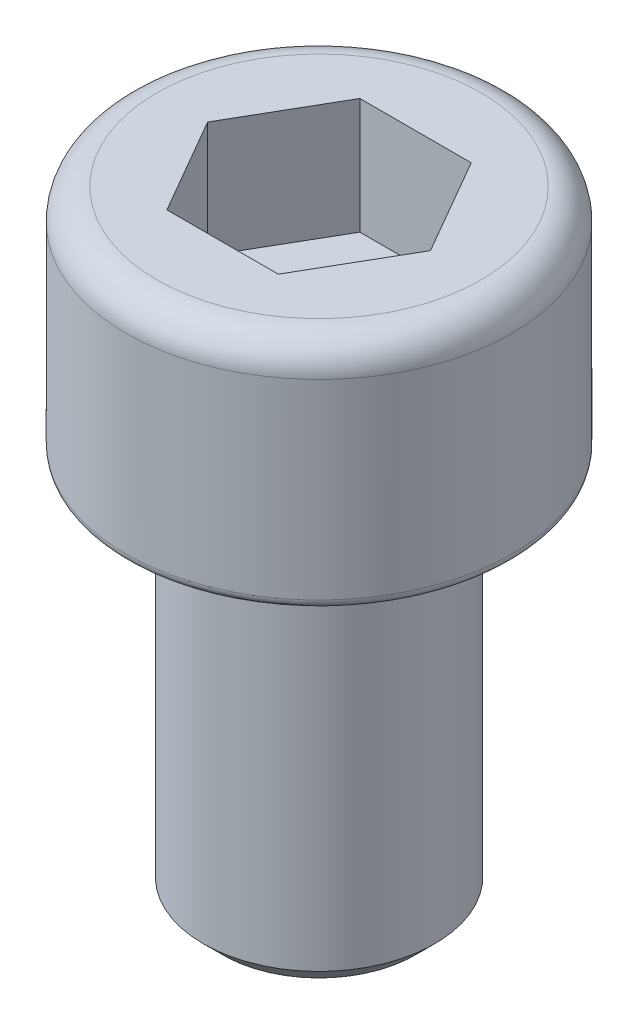
ISO-10303-21;
HEADER;
FILE_DESCRIPTION(('STEP AP214'),'2;1');
FILE_NAME('part.step','',(''),(''),'','','');
FILE_SCHEMA(('AUTOMOTIVE_DESIGN { 1 0 10303 214 1 1 1 1 }'));
ENDSEC;
DATA;
#1=APPLICATION_CONTEXT('core data for automotive mechanical design processes');
#2=APPLICATION_PROTOCOL_DEFINITION('international standard','automotive_design',2000,#1);
#3=PRODUCT_CONTEXT('',#1,'mechanical');
#4=PRODUCT('Part','Part','',(#3));
#5=PRODUCT_RELATED_PRODUCT_CATEGORY('part','',(#4));
#6=PRODUCT_DEFINITION_FORMATION('','',#4);
#7=PRODUCT_DEFINITION_CONTEXT('part definition',#1,'design');
#8=PRODUCT_DEFINITION('design','',#6,#7);
#9=PRODUCT_DEFINITION_SHAPE('','',#8);
#10=(LENGTH_UNIT() NAMED_UNIT(*) SI_UNIT(.MILLI.,.METRE.));
#11=(NAMED_UNIT(*) PLANE_ANGLE_UNIT() SI_UNIT($,.RADIAN.));
#12=(NAMED_UNIT(*) SI_UNIT($,.STERADIAN.) SOLID_ANGLE_UNIT());
#13=UNCERTAINTY_MEASURE_WITH_UNIT(LENGTH_MEASURE(1.E-05),#10,'distance_accuracy_value','');
#14=(GEOMETRIC_REPRESENTATION_CONTEXT(3) GLOBAL_UNCERTAINTY_ASSIGNED_CONTEXT((#13)) GLOBAL_UNIT_ASSIGNED_CONTEXT((#10,
#11,#12)) REPRESENTATION_CONTEXT('',''));
#15=CARTESIAN_POINT('',(0.,0.,0.));
#16=DIRECTION('',(0.,0.,1.));
#17=DIRECTION('',(1.,0.,0.));
#18=AXIS2_PLACEMENT_3D('',#15,#16,#17);
#19=CARTESIAN_POINT('',(0.,0.,0.));
#20=DIRECTION('',(0.,1.,0.));
#21=DIRECTION('',(0.,0.,1.));
#22=AXIS2_PLACEMENT_3D('',#19,#20,#21);
#23=PLANE('',#22);
#24=CARTESIAN_POINT('',(0.,0.,0.));
#25=DIRECTION('',(0.,1.,0.));
#26=DIRECTION('',(0.,0.,1.));
#27=AXIS2_PLACEMENT_3D('',#24,#25,#26);
#28=CIRCLE('',#27,4.2);
#29=CARTESIAN_POINT('',(0.,0.,4.2));
#30=VERTEX_POINT('',#29);
#31=EDGE_CURVE('E186',#30,#30,#28,.T.);
#32=ORIENTED_EDGE('',*,*,#31,.T.);
#33=EDGE_LOOP('',(#32));
#34=FACE_BOUND('',#33,.T.);
#35=DIRECTION('',(0.5,0.,-0.866025403784439));
#36=VECTOR('',#35,1.);
#37=CARTESIAN_POINT('',(1.44337567297406,0.,2.5));
#38=LINE('',#37,#36);
#39=CARTESIAN_POINT('',(1.44337567297406,0.,2.5));
#40=VERTEX_POINT('',#39);
#41=CARTESIAN_POINT('',(2.88675134594813,0.,0.));
#42=VERTEX_POINT('',#41);
#43=EDGE_CURVE('E73',#40,#42,#38,.T.);
#44=ORIENTED_EDGE('',*,*,#43,.F.);
#45=DIRECTION('',(1.,0.,0.));
#46=VECTOR('',#45,1.);
#47=CARTESIAN_POINT('',(-1.44337567297406,0.,2.5));
#48=LINE('',#47,#46);
#49=CARTESIAN_POINT('',(-1.44337567297406,0.,2.5));
#50=VERTEX_POINT('',#49);
#51=EDGE_CURVE('E167',#50,#40,#48,.T.);
#52=ORIENTED_EDGE('',*,*,#51,.F.);
#53=DIRECTION('',(0.5,0.,0.866025403784438));
#54=VECTOR('',#53,1.);
#55=CARTESIAN_POINT('',(-2.88675134594813,0.,0.));
#56=LINE('',#55,#54);
#57=CARTESIAN_POINT('',(-2.88675134594813,0.,0.));
#58=VERTEX_POINT('',#57);
#59=EDGE_CURVE('E164',#58,#50,#56,.T.);
#60=ORIENTED_EDGE('',*,*,#59,.F.);
#61=DIRECTION('',(-0.5,0.,0.866025403784439));
#62=VECTOR('',#61,1.);
#63=CARTESIAN_POINT('',(-1.44337567297407,0.,-2.5));
#64=LINE('',#63,#62);
#65=CARTESIAN_POINT('',(-1.44337567297407,0.,-2.5));
#66=VERTEX_POINT('',#65);
#67=EDGE_CURVE('E121',#66,#58,#64,.T.);
#68=ORIENTED_EDGE('',*,*,#67,.F.);
#69=DIRECTION('',(-1.,0.,0.));
#70=VECTOR('',#69,1.);
#71=CARTESIAN_POINT('',(1.44337567297406,0.,-2.5));
#72=LINE('',#71,#70);
#73=CARTESIAN_POINT('',(1.44337567297406,0.,-2.5));
#74=VERTEX_POINT('',#73);
#75=EDGE_CURVE('E158',#74,#66,#72,.T.);
#76=ORIENTED_EDGE('',*,*,#75,.F.);
#77=DIRECTION('',(-0.5,0.,-0.866025403784438));
#78=VECTOR('',#77,1.);
#79=CARTESIAN_POINT('',(2.88675134594813,0.,0.));
#80=LINE('',#79,#78);
#81=EDGE_CURVE('E154',#42,#74,#80,.T.);
#82=ORIENTED_EDGE('',*,*,#81,.F.);
#83=EDGE_LOOP('',(#44,#52,#60,#68,#76,#82));
#84=FACE_BOUND('',#83,.T.);
#85=ADVANCED_FACE('F57',(#34,#84),#23,.T.);
#86=CARTESIAN_POINT('',(0.,-21.,0.));
#87=DIRECTION('',(0.,-1.,0.));
#88=DIRECTION('',(0.,0.,-1.));
#89=AXIS2_PLACEMENT_3D('',#86,#87,#88);
#90=CYLINDRICAL_SURFACE('',#89,5.);
#91=CARTESIAN_POINT('',(0.,-5.75,0.));
#92=DIRECTION('',(0.,-1.,0.));
#93=DIRECTION('',(0.,0.,-1.));
#94=AXIS2_PLACEMENT_3D('',#91,#92,#93);
#95=CIRCLE('',#94,5.);
#96=CARTESIAN_POINT('',(0.,-5.75,-5.));
#97=VERTEX_POINT('',#96);
#98=EDGE_CURVE('E11',#97,#97,#95,.F.);
#99=ORIENTED_EDGE('',*,*,#98,.T.);
#100=EDGE_LOOP('',(#99));
#101=FACE_BOUND('',#100,.T.);
#102=CARTESIAN_POINT('',(0.,-0.799999999999999,0.));
#103=DIRECTION('',(0.,1.,0.));
#104=DIRECTION('',(0.,0.,1.));
#105=AXIS2_PLACEMENT_3D('',#102,#103,#104);
#106=CIRCLE('',#105,5.);
#107=CARTESIAN_POINT('',(0.,-0.799999999999999,5.));
#108=VERTEX_POINT('',#107);
#109=EDGE_CURVE('E173',#108,#108,#106,.F.);
#110=ORIENTED_EDGE('',*,*,#109,.T.);
#111=EDGE_LOOP('',(#110));
#112=FACE_BOUND('',#111,.T.);
#113=ADVANCED_FACE('F242',(#101,#112),#90,.T.);
#114=CARTESIAN_POINT('',(5.,-6.,0.));
#115=DIRECTION('',(0.,-1.,0.));
#116=DIRECTION('',(0.,0.,-1.));
#117=AXIS2_PLACEMENT_3D('',#114,#115,#116);
#118=PLANE('',#117);
#119=CARTESIAN_POINT('',(0.,-6.,0.));
#120=DIRECTION('',(0.,-1.,0.));
#121=DIRECTION('',(0.,0.,-1.));
#122=AXIS2_PLACEMENT_3D('',#119,#120,#121);
#123=CIRCLE('',#122,3.25);
#124=CARTESIAN_POINT('',(0.,-6.,-3.25));
#125=VERTEX_POINT('',#124);
#126=EDGE_CURVE('E66',#125,#125,#123,.F.);
#127=ORIENTED_EDGE('',*,*,#126,.T.);
#128=EDGE_LOOP('',(#127));
#129=FACE_BOUND('',#128,.T.);
#130=CARTESIAN_POINT('',(0.,-6.,0.));
#131=DIRECTION('',(0.,-1.,0.));
#132=DIRECTION('',(0.,0.,-1.));
#133=AXIS2_PLACEMENT_3D('',#130,#131,#132);
#134=CIRCLE('',#133,4.75);
#135=CARTESIAN_POINT('',(0.,-6.,-4.75));
#136=VERTEX_POINT('',#135);
#137=EDGE_CURVE('E202',#136,#136,#134,.T.);
#138=ORIENTED_EDGE('',*,*,#137,.T.);
#139=EDGE_LOOP('',(#138));
#140=FACE_BOUND('',#139,.T.);
#141=ADVANCED_FACE('F210',(#129,#140),#118,.T.);
#142=CARTESIAN_POINT('',(0.,-21.,0.));
#143=DIRECTION('',(0.,-1.,0.));
#144=DIRECTION('',(0.,0.,-1.));
#145=AXIS2_PLACEMENT_3D('',#142,#143,#144);
#146=CYLINDRICAL_SURFACE('',#145,3.);
#147=CARTESIAN_POINT('',(0.,-6.25,0.));
#148=DIRECTION('',(0.,-1.,0.));
#149=DIRECTION('',(0.,0.,-1.));
#150=AXIS2_PLACEMENT_3D('',#147,#148,#149);
#151=CIRCLE('',#150,3.);
#152=CARTESIAN_POINT('',(0.,-6.25,-3.));
#153=VERTEX_POINT('',#152);
#154=EDGE_CURVE('E198',#153,#153,#151,.T.);
#155=ORIENTED_EDGE('',*,*,#154,.T.);
#156=EDGE_LOOP('',(#155));
#157=FACE_BOUND('',#156,.T.);
#158=CARTESIAN_POINT('',(0.,-15.5,0.));
#159=DIRECTION('',(0.,-1.,0.));
#160=DIRECTION('',(0.,0.,-1.));
#161=AXIS2_PLACEMENT_3D('',#158,#159,#160);
#162=CIRCLE('',#161,3.);
#163=CARTESIAN_POINT('',(0.,-15.5,-3.));
#164=VERTEX_POINT('',#163);
#165=EDGE_CURVE('E194',#164,#164,#162,.F.);
#166=ORIENTED_EDGE('',*,*,#165,.T.);
#167=EDGE_LOOP('',(#166));
#168=FACE_BOUND('',#167,.T.);
#169=ADVANCED_FACE('F219',(#157,#168),#146,.T.);
#170=CARTESIAN_POINT('',(3.,-16.,0.));
#171=DIRECTION('',(0.,-1.,0.));
#172=DIRECTION('',(0.,0.,-1.));
#173=AXIS2_PLACEMENT_3D('',#170,#171,#172);
#174=PLANE('',#173);
#175=CARTESIAN_POINT('',(0.,-16.,0.));
#176=DIRECTION('',(0.,-1.,0.));
#177=DIRECTION('',(0.,0.,-1.));
#178=AXIS2_PLACEMENT_3D('',#175,#176,#177);
#179=CIRCLE('',#178,2.5);
#180=CARTESIAN_POINT('',(0.,-16.,-2.5));
#181=VERTEX_POINT('',#180);
#182=EDGE_CURVE('E190',#181,#181,#179,.T.);
#183=ORIENTED_EDGE('',*,*,#182,.T.);
#184=EDGE_LOOP('',(#183));
#185=FACE_BOUND('',#184,.T.);
#186=ADVANCED_FACE('F222',(#185),#174,.T.);
#187=CARTESIAN_POINT('',(1.44337567297406,-3.,2.5));
#188=DIRECTION('',(0.866025403784439,0.,0.5));
#189=DIRECTION('',(0.5,0.,-0.866025403784439));
#190=AXIS2_PLACEMENT_3D('',#187,#188,#189);
#191=PLANE('',#190);
#192=ORIENTED_EDGE('',*,*,#43,.T.);
#193=DIRECTION('',(0.,1.,0.));
#194=VECTOR('',#193,1.);
#195=CARTESIAN_POINT('',(2.88675134594813,-3.,0.));
#196=LINE('',#195,#194);
#197=CARTESIAN_POINT('',(2.88675134594813,-3.,0.));
#198=VERTEX_POINT('',#197);
#199=EDGE_CURVE('E103',#198,#42,#196,.T.);
#200=ORIENTED_EDGE('',*,*,#199,.F.);
#201=DIRECTION('',(0.5,0.,-0.866025403784439));
#202=VECTOR('',#201,1.);
#203=CARTESIAN_POINT('',(1.44337567297406,-3.,2.5));
#204=LINE('',#203,#202);
#205=CARTESIAN_POINT('',(1.44337567297406,-3.,2.5));
#206=VERTEX_POINT('',#205);
#207=EDGE_CURVE('E170',#206,#198,#204,.T.);
#208=ORIENTED_EDGE('',*,*,#207,.F.);
#209=DIRECTION('',(0.,1.,0.));
#210=VECTOR('',#209,1.);
#211=CARTESIAN_POINT('',(1.44337567297406,-3.,2.5));
#212=LINE('',#211,#210);
#213=EDGE_CURVE('E81',#206,#40,#212,.T.);
#214=ORIENTED_EDGE('',*,*,#213,.T.);
#215=EDGE_LOOP('',(#192,#200,#208,#214));
#216=FACE_BOUND('',#215,.T.);
#217=ADVANCED_FACE('F233',(#216),#191,.F.);
#218=CARTESIAN_POINT('',(-1.44337567297406,-3.,2.5));
#219=DIRECTION('',(0.,0.,1.));
#220=DIRECTION('',(1.,0.,0.));
#221=AXIS2_PLACEMENT_3D('',#218,#219,#220);
#222=PLANE('',#221);
#223=ORIENTED_EDGE('',*,*,#51,.T.);
#224=ORIENTED_EDGE('',*,*,#213,.F.);
#225=DIRECTION('',(1.,0.,0.));
#226=VECTOR('',#225,1.);
#227=CARTESIAN_POINT('',(-1.44337567297406,-3.,2.5));
#228=LINE('',#227,#226);
#229=CARTESIAN_POINT('',(-1.44337567297406,-3.,2.5));
#230=VERTEX_POINT('',#229);
#231=EDGE_CURVE('E135',#230,#206,#228,.T.);
#232=ORIENTED_EDGE('',*,*,#231,.F.);
#233=DIRECTION('',(0.,1.,0.));
#234=VECTOR('',#233,1.);
#235=CARTESIAN_POINT('',(-1.44337567297406,-3.,2.5));
#236=LINE('',#235,#234);
#237=EDGE_CURVE('E126',#230,#50,#236,.T.);
#238=ORIENTED_EDGE('',*,*,#237,.T.);
#239=EDGE_LOOP('',(#223,#224,#232,#238));
#240=FACE_BOUND('',#239,.T.);
#241=ADVANCED_FACE('F239',(#240),#222,.F.);
#242=CARTESIAN_POINT('',(-2.88675134594813,-3.,0.));
#243=DIRECTION('',(-0.866025403784438,0.,0.5));
#244=DIRECTION('',(0.5,0.,0.866025403784438));
#245=AXIS2_PLACEMENT_3D('',#242,#243,#244);
#246=PLANE('',#245);
#247=ORIENTED_EDGE('',*,*,#59,.T.);
#248=ORIENTED_EDGE('',*,*,#237,.F.);
#249=DIRECTION('',(0.5,0.,0.866025403784438));
#250=VECTOR('',#249,1.);
#251=CARTESIAN_POINT('',(-2.88675134594813,-3.,0.));
#252=LINE('',#251,#250);
#253=CARTESIAN_POINT('',(-2.88675134594813,-3.,0.));
#254=VERTEX_POINT('',#253);
#255=EDGE_CURVE('E130',#254,#230,#252,.T.);
#256=ORIENTED_EDGE('',*,*,#255,.F.);
#257=DIRECTION('',(0.,1.,0.));
#258=VECTOR('',#257,1.);
#259=CARTESIAN_POINT('',(-2.88675134594813,-3.,0.));
#260=LINE('',#259,#258);
#261=EDGE_CURVE('E114',#254,#58,#260,.T.);
#262=ORIENTED_EDGE('',*,*,#261,.T.);
#263=EDGE_LOOP('',(#247,#248,#256,#262));
#264=FACE_BOUND('',#263,.T.);
#265=ADVANCED_FACE('F131',(#264),#246,.F.);
#266=CARTESIAN_POINT('',(-1.44337567297407,-3.,-2.5));
#267=DIRECTION('',(-0.866025403784439,0.,-0.5));
#268=DIRECTION('',(-0.5,0.,0.866025403784439));
#269=AXIS2_PLACEMENT_3D('',#266,#267,#268);
#270=PLANE('',#269);
#271=ORIENTED_EDGE('',*,*,#67,.T.);
#272=ORIENTED_EDGE('',*,*,#261,.F.);
#273=DIRECTION('',(-0.5,0.,0.866025403784439));
#274=VECTOR('',#273,1.);
#275=CARTESIAN_POINT('',(-1.44337567297407,-3.,-2.5));
#276=LINE('',#275,#274);
#277=CARTESIAN_POINT('',(-1.44337567297407,-3.,-2.5));
#278=VERTEX_POINT('',#277);
#279=EDGE_CURVE('E118',#278,#254,#276,.T.);
#280=ORIENTED_EDGE('',*,*,#279,.F.);
#281=DIRECTION('',(0.,1.,0.));
#282=VECTOR('',#281,1.);
#283=CARTESIAN_POINT('',(-1.44337567297407,-3.,-2.5));
#284=LINE('',#283,#282);
#285=EDGE_CURVE('E127',#278,#66,#284,.T.);
#286=ORIENTED_EDGE('',*,*,#285,.T.);
#287=EDGE_LOOP('',(#271,#272,#280,#286));
#288=FACE_BOUND('',#287,.T.);
#289=ADVANCED_FACE('F116',(#288),#270,.F.);
#290=CARTESIAN_POINT('',(1.44337567297406,-3.,-2.5));
#291=DIRECTION('',(0.,0.,-1.));
#292=DIRECTION('',(-1.,0.,0.));
#293=AXIS2_PLACEMENT_3D('',#290,#291,#292);
#294=PLANE('',#293);
#295=ORIENTED_EDGE('',*,*,#75,.T.);
#296=ORIENTED_EDGE('',*,*,#285,.F.);
#297=DIRECTION('',(-1.,0.,0.));
#298=VECTOR('',#297,1.);
#299=CARTESIAN_POINT('',(1.44337567297406,-3.,-2.5));
#300=LINE('',#299,#298);
#301=CARTESIAN_POINT('',(1.44337567297406,-3.,-2.5));
#302=VERTEX_POINT('',#301);
#303=EDGE_CURVE('E141',#302,#278,#300,.T.);
#304=ORIENTED_EDGE('',*,*,#303,.F.);
#305=DIRECTION('',(0.,1.,0.));
#306=VECTOR('',#305,1.);
#307=CARTESIAN_POINT('',(1.44337567297406,-3.,-2.5));
#308=LINE('',#307,#306);
#309=EDGE_CURVE('E178',#302,#74,#308,.T.);
#310=ORIENTED_EDGE('',*,*,#309,.T.);
#311=EDGE_LOOP('',(#295,#296,#304,#310));
#312=FACE_BOUND('',#311,.T.);
#313=ADVANCED_FACE('F270',(#312),#294,.F.);
#314=CARTESIAN_POINT('',(2.88675134594813,-3.,0.));
#315=DIRECTION('',(0.866025403784438,0.,-0.5));
#316=DIRECTION('',(-0.5,0.,-0.866025403784438));
#317=AXIS2_PLACEMENT_3D('',#314,#315,#316);
#318=PLANE('',#317);
#319=ORIENTED_EDGE('',*,*,#81,.T.);
#320=ORIENTED_EDGE('',*,*,#309,.F.);
#321=DIRECTION('',(-0.5,0.,-0.866025403784438));
#322=VECTOR('',#321,1.);
#323=CARTESIAN_POINT('',(2.88675134594813,-3.,0.));
#324=LINE('',#323,#322);
#325=EDGE_CURVE('E146',#198,#302,#324,.T.);
#326=ORIENTED_EDGE('',*,*,#325,.F.);
#327=ORIENTED_EDGE('',*,*,#199,.T.);
#328=EDGE_LOOP('',(#319,#320,#326,#327));
#329=FACE_BOUND('',#328,.T.);
#330=ADVANCED_FACE('F261',(#329),#318,.F.);
#331=CARTESIAN_POINT('',(0.,-3.,0.));
#332=DIRECTION('',(0.,1.,0.));
#333=DIRECTION('',(0.,0.,1.));
#334=AXIS2_PLACEMENT_3D('',#331,#332,#333);
#335=PLANE('',#334);
#336=ORIENTED_EDGE('',*,*,#207,.T.);
#337=ORIENTED_EDGE('',*,*,#325,.T.);
#338=ORIENTED_EDGE('',*,*,#303,.T.);
#339=ORIENTED_EDGE('',*,*,#279,.T.);
#340=ORIENTED_EDGE('',*,*,#255,.T.);
#341=ORIENTED_EDGE('',*,*,#231,.T.);
#342=EDGE_LOOP('',(#336,#337,#338,#339,#340,#341));
#343=FACE_BOUND('',#342,.T.);
#344=ADVANCED_FACE('F138',(#343),#335,.T.);
#345=CARTESIAN_POINT('',(0.,-0.799999999999999,0.));
#346=DIRECTION('',(0.,1.,0.));
#347=DIRECTION('',(0.,0.,1.));
#348=AXIS2_PLACEMENT_3D('',#345,#346,#347);
#349=TOROIDAL_SURFACE('',#348,4.2,0.8);
#350=ORIENTED_EDGE('',*,*,#31,.F.);
#351=EDGE_LOOP('',(#350));
#352=FACE_BOUND('',#351,.T.);
#353=ORIENTED_EDGE('',*,*,#109,.F.);
#354=EDGE_LOOP('',(#353));
#355=FACE_BOUND('',#354,.T.);
#356=ADVANCED_FACE('F228',(#352,#355),#349,.T.);
#357=CARTESIAN_POINT('',(0.,-16.,0.));
#358=DIRECTION('',(0.,1.,0.));
#359=DIRECTION('',(0.,0.,1.));
#360=AXIS2_PLACEMENT_3D('',#357,#358,#359);
#361=CONICAL_SURFACE('',#360,2.5,0.785398163397447);
#362=ORIENTED_EDGE('',*,*,#165,.F.);
#363=EDGE_LOOP('',(#362));
#364=FACE_BOUND('',#363,.T.);
#365=ORIENTED_EDGE('',*,*,#182,.F.);
#366=EDGE_LOOP('',(#365));
#367=FACE_BOUND('',#366,.T.);
#368=ADVANCED_FACE('F216',(#364,#367),#361,.T.);
#369=CARTESIAN_POINT('',(0.,-6.25,0.));
#370=DIRECTION('',(0.,-1.,0.));
#371=DIRECTION('',(0.,0.,-1.));
#372=AXIS2_PLACEMENT_3D('',#369,#370,#371);
#373=TOROIDAL_SURFACE('',#372,3.25,0.25);
#374=ORIENTED_EDGE('',*,*,#126,.F.);
#375=EDGE_LOOP('',(#374));
#376=FACE_BOUND('',#375,.T.);
#377=ORIENTED_EDGE('',*,*,#154,.F.);
#378=EDGE_LOOP('',(#377));
#379=FACE_BOUND('',#378,.T.);
#380=ADVANCED_FACE('F213',(#376,#379),#373,.F.);
#381=CARTESIAN_POINT('',(0.,-5.75,0.));
#382=DIRECTION('',(0.,-1.,0.));
#383=DIRECTION('',(0.,0.,-1.));
#384=AXIS2_PLACEMENT_3D('',#381,#382,#383);
#385=TOROIDAL_SURFACE('',#384,4.75,0.25);
#386=ORIENTED_EDGE('',*,*,#98,.F.);
#387=EDGE_LOOP('',(#386));
#388=FACE_BOUND('',#387,.T.);
#389=ORIENTED_EDGE('',*,*,#137,.F.);
#390=EDGE_LOOP('',(#389));
#391=FACE_BOUND('',#390,.T.);
#392=ADVANCED_FACE('F59',(#388,#391),#385,.T.);
#393=CLOSED_SHELL('',(#85,#113,#141,#169,#186,#217,#241,#265,#289,#313,#330,#344,#356,#368,#380,#392));
#394=MANIFOLD_SOLID_BREP('B2',#393);
#395=ADVANCED_BREP_SHAPE_REPRESENTATION('',(#18,#394),#14);
#396=SHAPE_DEFINITION_REPRESENTATION(#9,#395);
ENDSEC;
END-ISO-10303-21;
